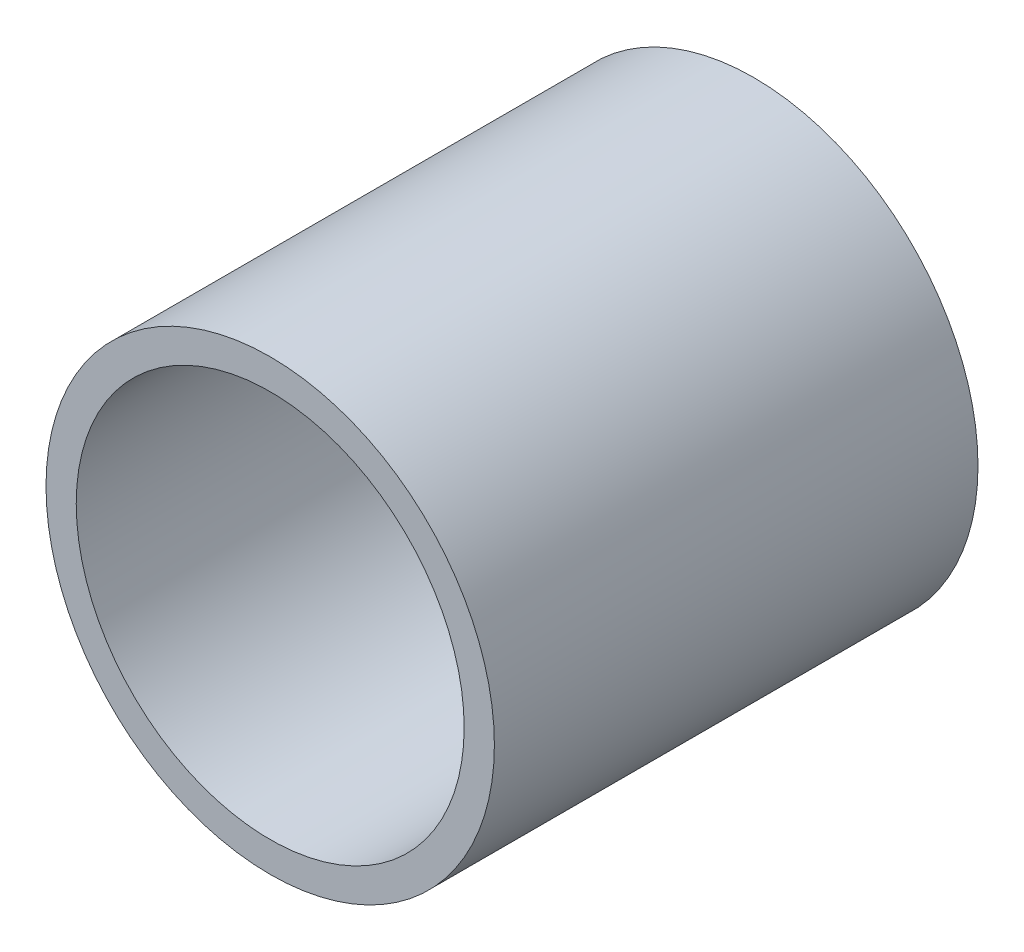
ISO-10303-21;
HEADER;
FILE_DESCRIPTION(('STEP AP214'),'2;1');
FILE_NAME('part.step','',(''),(''),'','','');
FILE_SCHEMA(('AUTOMOTIVE_DESIGN { 1 0 10303 214 1 1 1 1 }'));
ENDSEC;
DATA;
#1=APPLICATION_CONTEXT('core data for automotive mechanical design processes');
#2=APPLICATION_PROTOCOL_DEFINITION('international standard','automotive_design',2000,#1);
#3=PRODUCT_CONTEXT('',#1,'mechanical');
#4=PRODUCT('Part','Part','',(#3));
#5=PRODUCT_RELATED_PRODUCT_CATEGORY('part','',(#4));
#6=PRODUCT_DEFINITION_FORMATION('','',#4);
#7=PRODUCT_DEFINITION_CONTEXT('part definition',#1,'design');
#8=PRODUCT_DEFINITION('design','',#6,#7);
#9=PRODUCT_DEFINITION_SHAPE('','',#8);
#10=(LENGTH_UNIT() NAMED_UNIT(*) SI_UNIT(.MILLI.,.METRE.));
#11=(NAMED_UNIT(*) PLANE_ANGLE_UNIT() SI_UNIT($,.RADIAN.));
#12=(NAMED_UNIT(*) SI_UNIT($,.STERADIAN.) SOLID_ANGLE_UNIT());
#13=UNCERTAINTY_MEASURE_WITH_UNIT(LENGTH_MEASURE(1.E-05),#10,'distance_accuracy_value','');
#14=(GEOMETRIC_REPRESENTATION_CONTEXT(3) GLOBAL_UNCERTAINTY_ASSIGNED_CONTEXT((#13)) GLOBAL_UNIT_ASSIGNED_CONTEXT((#10,
#11,#12)) REPRESENTATION_CONTEXT('',''));
#15=CARTESIAN_POINT('',(0.,0.,0.));
#16=DIRECTION('',(0.,0.,1.));
#17=DIRECTION('',(1.,0.,0.));
#18=AXIS2_PLACEMENT_3D('',#15,#16,#17);
#19=CARTESIAN_POINT('',(0.,0.,0.));
#20=DIRECTION('',(0.,0.,1.));
#21=DIRECTION('',(1.,0.,0.));
#22=AXIS2_PLACEMENT_3D('',#19,#20,#21);
#23=CYLINDRICAL_SURFACE('',#22,61.1251);
#24=CARTESIAN_POINT('',(0.,0.,76.2));
#25=DIRECTION('',(0.,0.,1.));
#26=DIRECTION('',(1.,0.,0.));
#27=AXIS2_PLACEMENT_3D('',#24,#25,#26);
#28=CIRCLE('',#27,61.1251);
#29=CARTESIAN_POINT('',(61.1251,0.,76.2));
#30=VERTEX_POINT('',#29);
#31=EDGE_CURVE('E27',#30,#30,#28,.T.);
#32=ORIENTED_EDGE('',*,*,#31,.T.);
#33=EDGE_LOOP('',(#32));
#34=FACE_BOUND('',#33,.T.);
#35=CARTESIAN_POINT('',(0.,0.,-76.2));
#36=DIRECTION('',(0.,0.,1.));
#37=DIRECTION('',(1.,0.,0.));
#38=AXIS2_PLACEMENT_3D('',#35,#36,#37);
#39=CIRCLE('',#38,61.1251);
#40=CARTESIAN_POINT('',(61.1251,0.,-76.2));
#41=VERTEX_POINT('',#40);
#42=EDGE_CURVE('E18',#41,#41,#39,.T.);
#43=ORIENTED_EDGE('',*,*,#42,.F.);
#44=EDGE_LOOP('',(#43));
#45=FACE_BOUND('',#44,.T.);
#46=ADVANCED_FACE('F15',(#34,#45),#23,.F.);
#47=CARTESIAN_POINT('',(0.,0.,-76.2));
#48=DIRECTION('',(0.,0.,-1.));
#49=DIRECTION('',(-1.,0.,0.));
#50=AXIS2_PLACEMENT_3D('',#47,#48,#49);
#51=PLANE('',#50);
#52=ORIENTED_EDGE('',*,*,#42,.T.);
#53=EDGE_LOOP('',(#52));
#54=FACE_BOUND('',#53,.T.);
#55=CARTESIAN_POINT('',(0.,0.,-76.2));
#56=DIRECTION('',(0.,0.,1.));
#57=DIRECTION('',(1.,0.,0.));
#58=AXIS2_PLACEMENT_3D('',#55,#56,#57);
#59=CIRCLE('',#58,70.6501);
#60=CARTESIAN_POINT('',(70.6501,0.,-76.2));
#61=VERTEX_POINT('',#60);
#62=EDGE_CURVE('E22',#61,#61,#59,.T.);
#63=ORIENTED_EDGE('',*,*,#62,.F.);
#64=EDGE_LOOP('',(#63));
#65=FACE_BOUND('',#64,.T.);
#66=ADVANCED_FACE('F35',(#54,#65),#51,.T.);
#67=CARTESIAN_POINT('',(0.,0.,76.2));
#68=DIRECTION('',(0.,0.,-1.));
#69=DIRECTION('',(-1.,0.,0.));
#70=AXIS2_PLACEMENT_3D('',#67,#68,#69);
#71=PLANE('',#70);
#72=ORIENTED_EDGE('',*,*,#31,.F.);
#73=EDGE_LOOP('',(#72));
#74=FACE_BOUND('',#73,.T.);
#75=CARTESIAN_POINT('',(0.,0.,76.2));
#76=DIRECTION('',(0.,0.,1.));
#77=DIRECTION('',(1.,0.,0.));
#78=AXIS2_PLACEMENT_3D('',#75,#76,#77);
#79=CIRCLE('',#78,70.6501);
#80=CARTESIAN_POINT('',(70.6501,0.,76.2));
#81=VERTEX_POINT('',#80);
#82=EDGE_CURVE('E10',#81,#81,#79,.F.);
#83=ORIENTED_EDGE('',*,*,#82,.F.);
#84=EDGE_LOOP('',(#83));
#85=FACE_BOUND('',#84,.T.);
#86=ADVANCED_FACE('F43',(#74,#85),#71,.F.);
#87=CARTESIAN_POINT('',(0.,0.,0.));
#88=DIRECTION('',(0.,0.,1.));
#89=DIRECTION('',(1.,0.,0.));
#90=AXIS2_PLACEMENT_3D('',#87,#88,#89);
#91=CYLINDRICAL_SURFACE('',#90,70.6501);
#92=ORIENTED_EDGE('',*,*,#82,.T.);
#93=EDGE_LOOP('',(#92));
#94=FACE_BOUND('',#93,.T.);
#95=ORIENTED_EDGE('',*,*,#62,.T.);
#96=EDGE_LOOP('',(#95));
#97=FACE_BOUND('',#96,.T.);
#98=ADVANCED_FACE('F44',(#94,#97),#91,.T.);
#99=CLOSED_SHELL('',(#46,#66,#86,#98));
#100=MANIFOLD_SOLID_BREP('B1',#99);
#101=ADVANCED_BREP_SHAPE_REPRESENTATION('',(#18,#100),#14);
#102=SHAPE_DEFINITION_REPRESENTATION(#9,#101);
ENDSEC;
END-ISO-10303-21;
